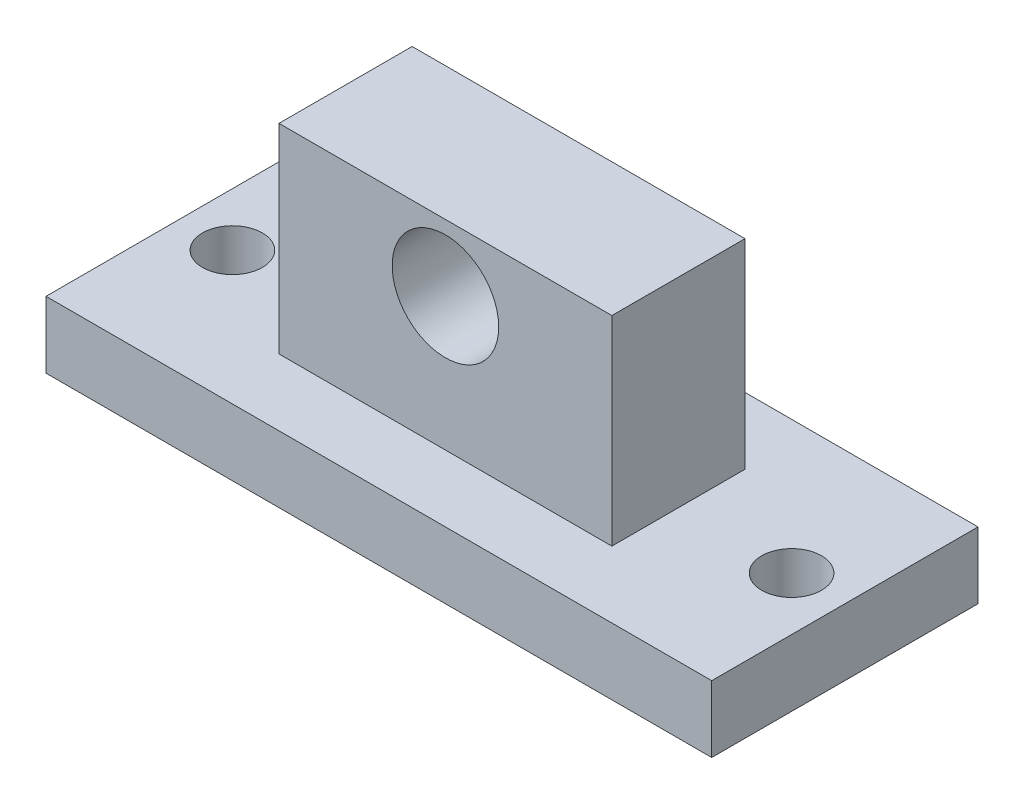
ISO-10303-21;
HEADER;
FILE_DESCRIPTION(('STEP AP214'),'2;1');
FILE_NAME('part.step','',(''),(''),'','','');
FILE_SCHEMA(('AUTOMOTIVE_DESIGN { 1 0 10303 214 1 1 1 1 }'));
ENDSEC;
DATA;
#1=APPLICATION_CONTEXT('core data for automotive mechanical design processes');
#2=APPLICATION_PROTOCOL_DEFINITION('international standard','automotive_design',2000,#1);
#3=PRODUCT_CONTEXT('',#1,'mechanical');
#4=PRODUCT('Part','Part','',(#3));
#5=PRODUCT_RELATED_PRODUCT_CATEGORY('part','',(#4));
#6=PRODUCT_DEFINITION_FORMATION('','',#4);
#7=PRODUCT_DEFINITION_CONTEXT('part definition',#1,'design');
#8=PRODUCT_DEFINITION('design','',#6,#7);
#9=PRODUCT_DEFINITION_SHAPE('','',#8);
#10=(LENGTH_UNIT() NAMED_UNIT(*) SI_UNIT(.MILLI.,.METRE.));
#11=(NAMED_UNIT(*) PLANE_ANGLE_UNIT() SI_UNIT($,.RADIAN.));
#12=(NAMED_UNIT(*) SI_UNIT($,.STERADIAN.) SOLID_ANGLE_UNIT());
#13=UNCERTAINTY_MEASURE_WITH_UNIT(LENGTH_MEASURE(1.E-05),#10,'distance_accuracy_value','');
#14=(GEOMETRIC_REPRESENTATION_CONTEXT(3) GLOBAL_UNCERTAINTY_ASSIGNED_CONTEXT((#13)) GLOBAL_UNIT_ASSIGNED_CONTEXT((#10,
#11,#12)) REPRESENTATION_CONTEXT('',''));
#15=CARTESIAN_POINT('',(0.,0.,0.));
#16=DIRECTION('',(0.,0.,1.));
#17=DIRECTION('',(1.,0.,0.));
#18=AXIS2_PLACEMENT_3D('',#15,#16,#17);
#19=CARTESIAN_POINT('',(0.,5.,0.));
#20=DIRECTION('',(0.,-1.,0.));
#21=DIRECTION('',(0.,0.,-1.));
#22=AXIS2_PLACEMENT_3D('',#19,#20,#21);
#23=PLANE('',#22);
#24=DIRECTION('',(0.,0.,-1.));
#25=VECTOR('',#24,1.);
#26=CARTESIAN_POINT('',(25.,5.,10.));
#27=LINE('',#26,#25);
#28=CARTESIAN_POINT('',(25.,5.,10.));
#29=VERTEX_POINT('',#28);
#30=CARTESIAN_POINT('',(25.,5.,-10.));
#31=VERTEX_POINT('',#30);
#32=EDGE_CURVE('E136',#29,#31,#27,.T.);
#33=ORIENTED_EDGE('',*,*,#32,.T.);
#34=DIRECTION('',(-1.,0.,0.));
#35=VECTOR('',#34,1.);
#36=CARTESIAN_POINT('',(-25.,5.,-10.));
#37=LINE('',#36,#35);
#38=CARTESIAN_POINT('',(-25.,5.,-10.));
#39=VERTEX_POINT('',#38);
#40=EDGE_CURVE('E139',#31,#39,#37,.T.);
#41=ORIENTED_EDGE('',*,*,#40,.T.);
#42=DIRECTION('',(0.,0.,1.));
#43=VECTOR('',#42,1.);
#44=CARTESIAN_POINT('',(-25.,5.,10.));
#45=LINE('',#44,#43);
#46=CARTESIAN_POINT('',(-25.,5.,10.));
#47=VERTEX_POINT('',#46);
#48=EDGE_CURVE('E142',#39,#47,#45,.T.);
#49=ORIENTED_EDGE('',*,*,#48,.T.);
#50=DIRECTION('',(1.,0.,0.));
#51=VECTOR('',#50,1.);
#52=CARTESIAN_POINT('',(-25.,5.,10.));
#53=LINE('',#52,#51);
#54=EDGE_CURVE('E144',#47,#29,#53,.T.);
#55=ORIENTED_EDGE('',*,*,#54,.T.);
#56=EDGE_LOOP('',(#33,#41,#49,#55));
#57=FACE_BOUND('',#56,.T.);
#58=CARTESIAN_POINT('',(21.,5.,0.));
#59=DIRECTION('',(0.,1.,0.));
#60=DIRECTION('',(0.,0.,1.));
#61=AXIS2_PLACEMENT_3D('',#58,#59,#60);
#62=CIRCLE('',#61,2.25);
#63=CARTESIAN_POINT('',(21.,5.,2.25));
#64=VERTEX_POINT('',#63);
#65=EDGE_CURVE('E118',#64,#64,#62,.T.);
#66=ORIENTED_EDGE('',*,*,#65,.F.);
#67=EDGE_LOOP('',(#66));
#68=FACE_BOUND('',#67,.T.);
#69=CARTESIAN_POINT('',(-21.,5.,0.));
#70=DIRECTION('',(0.,1.,0.));
#71=DIRECTION('',(0.,0.,1.));
#72=AXIS2_PLACEMENT_3D('',#69,#70,#71);
#73=CIRCLE('',#72,2.25);
#74=CARTESIAN_POINT('',(-21.,5.,2.25));
#75=VERTEX_POINT('',#74);
#76=EDGE_CURVE('E131',#75,#75,#73,.T.);
#77=ORIENTED_EDGE('',*,*,#76,.F.);
#78=EDGE_LOOP('',(#77));
#79=FACE_BOUND('',#78,.T.);
#80=DIRECTION('',(0.,0.,-1.));
#81=VECTOR('',#80,1.);
#82=CARTESIAN_POINT('',(12.5,5.,5.));
#83=LINE('',#82,#81);
#84=CARTESIAN_POINT('',(12.5,5.,5.));
#85=VERTEX_POINT('',#84);
#86=CARTESIAN_POINT('',(12.5,5.,-5.));
#87=VERTEX_POINT('',#86);
#88=EDGE_CURVE('E117',#85,#87,#83,.T.);
#89=ORIENTED_EDGE('',*,*,#88,.F.);
#90=DIRECTION('',(1.,0.,0.));
#91=VECTOR('',#90,1.);
#92=CARTESIAN_POINT('',(-12.5,5.,5.));
#93=LINE('',#92,#91);
#94=CARTESIAN_POINT('',(-12.5,5.,5.));
#95=VERTEX_POINT('',#94);
#96=EDGE_CURVE('E114',#95,#85,#93,.T.);
#97=ORIENTED_EDGE('',*,*,#96,.F.);
#98=DIRECTION('',(0.,0.,1.));
#99=VECTOR('',#98,1.);
#100=CARTESIAN_POINT('',(-12.5,5.,5.));
#101=LINE('',#100,#99);
#102=CARTESIAN_POINT('',(-12.5,5.,-5.));
#103=VERTEX_POINT('',#102);
#104=EDGE_CURVE('E52',#103,#95,#101,.T.);
#105=ORIENTED_EDGE('',*,*,#104,.F.);
#106=DIRECTION('',(-1.,0.,0.));
#107=VECTOR('',#106,1.);
#108=CARTESIAN_POINT('',(-12.5,5.,-5.));
#109=LINE('',#108,#107);
#110=EDGE_CURVE('E47',#87,#103,#109,.T.);
#111=ORIENTED_EDGE('',*,*,#110,.F.);
#112=EDGE_LOOP('',(#89,#97,#105,#111));
#113=FACE_BOUND('',#112,.T.);
#114=ADVANCED_FACE('F32',(#57,#68,#79,#113),#23,.F.);
#115=CARTESIAN_POINT('',(25.,5.,10.));
#116=DIRECTION('',(-1.,0.,0.));
#117=DIRECTION('',(0.,0.,1.));
#118=AXIS2_PLACEMENT_3D('',#115,#116,#117);
#119=PLANE('',#118);
#120=DIRECTION('',(0.,0.,-1.));
#121=VECTOR('',#120,1.);
#122=CARTESIAN_POINT('',(25.,0.,10.));
#123=LINE('',#122,#121);
#124=CARTESIAN_POINT('',(25.,0.,10.));
#125=VERTEX_POINT('',#124);
#126=CARTESIAN_POINT('',(25.,0.,-10.));
#127=VERTEX_POINT('',#126);
#128=EDGE_CURVE('E130',#125,#127,#123,.T.);
#129=ORIENTED_EDGE('',*,*,#128,.T.);
#130=DIRECTION('',(0.,-1.,0.));
#131=VECTOR('',#130,1.);
#132=CARTESIAN_POINT('',(25.,5.,-10.));
#133=LINE('',#132,#131);
#134=EDGE_CURVE('E11',#31,#127,#133,.T.);
#135=ORIENTED_EDGE('',*,*,#134,.F.);
#136=ORIENTED_EDGE('',*,*,#32,.F.);
#137=DIRECTION('',(0.,-1.,0.));
#138=VECTOR('',#137,1.);
#139=CARTESIAN_POINT('',(25.,5.,10.));
#140=LINE('',#139,#138);
#141=EDGE_CURVE('E146',#29,#125,#140,.T.);
#142=ORIENTED_EDGE('',*,*,#141,.T.);
#143=EDGE_LOOP('',(#129,#135,#136,#142));
#144=FACE_BOUND('',#143,.T.);
#145=ADVANCED_FACE('F34',(#144),#119,.F.);
#146=CARTESIAN_POINT('',(-25.,5.,-10.));
#147=DIRECTION('',(0.,0.,1.));
#148=DIRECTION('',(1.,0.,0.));
#149=AXIS2_PLACEMENT_3D('',#146,#147,#148);
#150=PLANE('',#149);
#151=DIRECTION('',(-1.,0.,0.));
#152=VECTOR('',#151,1.);
#153=CARTESIAN_POINT('',(-25.,0.,-10.));
#154=LINE('',#153,#152);
#155=CARTESIAN_POINT('',(-25.,0.,-10.));
#156=VERTEX_POINT('',#155);
#157=EDGE_CURVE('E149',#127,#156,#154,.T.);
#158=ORIENTED_EDGE('',*,*,#157,.T.);
#159=DIRECTION('',(0.,-1.,0.));
#160=VECTOR('',#159,1.);
#161=CARTESIAN_POINT('',(-25.,5.,-10.));
#162=LINE('',#161,#160);
#163=EDGE_CURVE('E40',#39,#156,#162,.T.);
#164=ORIENTED_EDGE('',*,*,#163,.F.);
#165=ORIENTED_EDGE('',*,*,#40,.F.);
#166=ORIENTED_EDGE('',*,*,#134,.T.);
#167=EDGE_LOOP('',(#158,#164,#165,#166));
#168=FACE_BOUND('',#167,.T.);
#169=ADVANCED_FACE('F179',(#168),#150,.F.);
#170=CARTESIAN_POINT('',(-25.,5.,10.));
#171=DIRECTION('',(1.,0.,0.));
#172=DIRECTION('',(0.,0.,-1.));
#173=AXIS2_PLACEMENT_3D('',#170,#171,#172);
#174=PLANE('',#173);
#175=DIRECTION('',(0.,0.,1.));
#176=VECTOR('',#175,1.);
#177=CARTESIAN_POINT('',(-25.,0.,10.));
#178=LINE('',#177,#176);
#179=CARTESIAN_POINT('',(-25.,0.,10.));
#180=VERTEX_POINT('',#179);
#181=EDGE_CURVE('E151',#156,#180,#178,.T.);
#182=ORIENTED_EDGE('',*,*,#181,.T.);
#183=DIRECTION('',(0.,-1.,0.));
#184=VECTOR('',#183,1.);
#185=CARTESIAN_POINT('',(-25.,5.,10.));
#186=LINE('',#185,#184);
#187=EDGE_CURVE('E156',#47,#180,#186,.T.);
#188=ORIENTED_EDGE('',*,*,#187,.F.);
#189=ORIENTED_EDGE('',*,*,#48,.F.);
#190=ORIENTED_EDGE('',*,*,#163,.T.);
#191=EDGE_LOOP('',(#182,#188,#189,#190));
#192=FACE_BOUND('',#191,.T.);
#193=ADVANCED_FACE('F163',(#192),#174,.F.);
#194=CARTESIAN_POINT('',(-25.,5.,10.));
#195=DIRECTION('',(0.,0.,-1.));
#196=DIRECTION('',(-1.,0.,0.));
#197=AXIS2_PLACEMENT_3D('',#194,#195,#196);
#198=PLANE('',#197);
#199=DIRECTION('',(1.,0.,0.));
#200=VECTOR('',#199,1.);
#201=CARTESIAN_POINT('',(-25.,0.,10.));
#202=LINE('',#201,#200);
#203=EDGE_CURVE('E140',#180,#125,#202,.T.);
#204=ORIENTED_EDGE('',*,*,#203,.T.);
#205=ORIENTED_EDGE('',*,*,#141,.F.);
#206=ORIENTED_EDGE('',*,*,#54,.F.);
#207=ORIENTED_EDGE('',*,*,#187,.T.);
#208=EDGE_LOOP('',(#204,#205,#206,#207));
#209=FACE_BOUND('',#208,.T.);
#210=ADVANCED_FACE('F172',(#209),#198,.F.);
#211=CARTESIAN_POINT('',(0.,0.,0.));
#212=DIRECTION('',(0.,-1.,0.));
#213=DIRECTION('',(0.,0.,-1.));
#214=AXIS2_PLACEMENT_3D('',#211,#212,#213);
#215=PLANE('',#214);
#216=CARTESIAN_POINT('',(-21.,0.,0.));
#217=DIRECTION('',(0.,1.,0.));
#218=DIRECTION('',(0.,0.,1.));
#219=AXIS2_PLACEMENT_3D('',#216,#217,#218);
#220=CIRCLE('',#219,2.25);
#221=CARTESIAN_POINT('',(-21.,0.,2.25));
#222=VERTEX_POINT('',#221);
#223=EDGE_CURVE('E127',#222,#222,#220,.T.);
#224=ORIENTED_EDGE('',*,*,#223,.T.);
#225=EDGE_LOOP('',(#224));
#226=FACE_BOUND('',#225,.T.);
#227=CARTESIAN_POINT('',(21.,0.,0.));
#228=DIRECTION('',(0.,1.,0.));
#229=DIRECTION('',(0.,0.,1.));
#230=AXIS2_PLACEMENT_3D('',#227,#228,#229);
#231=CIRCLE('',#230,2.25);
#232=CARTESIAN_POINT('',(21.,0.,2.25));
#233=VERTEX_POINT('',#232);
#234=EDGE_CURVE('E121',#233,#233,#231,.T.);
#235=ORIENTED_EDGE('',*,*,#234,.T.);
#236=EDGE_LOOP('',(#235));
#237=FACE_BOUND('',#236,.T.);
#238=ORIENTED_EDGE('',*,*,#128,.F.);
#239=ORIENTED_EDGE('',*,*,#203,.F.);
#240=ORIENTED_EDGE('',*,*,#181,.F.);
#241=ORIENTED_EDGE('',*,*,#157,.F.);
#242=EDGE_LOOP('',(#238,#239,#240,#241));
#243=FACE_BOUND('',#242,.T.);
#244=ADVANCED_FACE('F169',(#226,#237,#243),#215,.T.);
#245=CARTESIAN_POINT('',(21.,0.,0.));
#246=DIRECTION('',(0.,1.,0.));
#247=DIRECTION('',(0.,0.,1.));
#248=AXIS2_PLACEMENT_3D('',#245,#246,#247);
#249=CYLINDRICAL_SURFACE('',#248,2.25);
#250=ORIENTED_EDGE('',*,*,#234,.F.);
#251=EDGE_LOOP('',(#250));
#252=FACE_BOUND('',#251,.T.);
#253=ORIENTED_EDGE('',*,*,#65,.T.);
#254=EDGE_LOOP('',(#253));
#255=FACE_BOUND('',#254,.T.);
#256=ADVANCED_FACE('F192',(#252,#255),#249,.F.);
#257=CARTESIAN_POINT('',(-21.,0.,0.));
#258=DIRECTION('',(0.,1.,0.));
#259=DIRECTION('',(0.,0.,1.));
#260=AXIS2_PLACEMENT_3D('',#257,#258,#259);
#261=CYLINDRICAL_SURFACE('',#260,2.25);
#262=ORIENTED_EDGE('',*,*,#223,.F.);
#263=EDGE_LOOP('',(#262));
#264=FACE_BOUND('',#263,.T.);
#265=ORIENTED_EDGE('',*,*,#76,.T.);
#266=EDGE_LOOP('',(#265));
#267=FACE_BOUND('',#266,.T.);
#268=ADVANCED_FACE('F212',(#264,#267),#261,.F.);
#269=CARTESIAN_POINT('',(12.5,20.,5.));
#270=DIRECTION('',(-1.,0.,0.));
#271=DIRECTION('',(0.,0.,1.));
#272=AXIS2_PLACEMENT_3D('',#269,#270,#271);
#273=PLANE('',#272);
#274=ORIENTED_EDGE('',*,*,#88,.T.);
#275=DIRECTION('',(0.,-1.,0.));
#276=VECTOR('',#275,1.);
#277=CARTESIAN_POINT('',(12.5,20.,-5.));
#278=LINE('',#277,#276);
#279=CARTESIAN_POINT('',(12.5,20.,-5.));
#280=VERTEX_POINT('',#279);
#281=EDGE_CURVE('E98',#280,#87,#278,.T.);
#282=ORIENTED_EDGE('',*,*,#281,.F.);
#283=DIRECTION('',(0.,0.,-1.));
#284=VECTOR('',#283,1.);
#285=CARTESIAN_POINT('',(12.5,20.,5.));
#286=LINE('',#285,#284);
#287=CARTESIAN_POINT('',(12.5,20.,5.));
#288=VERTEX_POINT('',#287);
#289=EDGE_CURVE('E105',#288,#280,#286,.T.);
#290=ORIENTED_EDGE('',*,*,#289,.F.);
#291=DIRECTION('',(0.,-1.,0.));
#292=VECTOR('',#291,1.);
#293=CARTESIAN_POINT('',(12.5,20.,5.));
#294=LINE('',#293,#292);
#295=EDGE_CURVE('E314',#288,#85,#294,.T.);
#296=ORIENTED_EDGE('',*,*,#295,.T.);
#297=EDGE_LOOP('',(#274,#282,#290,#296));
#298=FACE_BOUND('',#297,.T.);
#299=ADVANCED_FACE('F116',(#298),#273,.F.);
#300=CARTESIAN_POINT('',(-12.5,20.,-5.));
#301=DIRECTION('',(0.,0.,1.));
#302=DIRECTION('',(1.,0.,0.));
#303=AXIS2_PLACEMENT_3D('',#300,#301,#302);
#304=PLANE('',#303);
#305=CARTESIAN_POINT('',(0.,15.,-5.));
#306=DIRECTION('',(0.,0.,1.));
#307=DIRECTION('',(1.,0.,0.));
#308=AXIS2_PLACEMENT_3D('',#305,#306,#307);
#309=CIRCLE('',#308,4.);
#310=CARTESIAN_POINT('',(4.,15.,-5.));
#311=VERTEX_POINT('',#310);
#312=EDGE_CURVE('E308',#311,#311,#309,.T.);
#313=ORIENTED_EDGE('',*,*,#312,.T.);
#314=EDGE_LOOP('',(#313));
#315=FACE_BOUND('',#314,.T.);
#316=ORIENTED_EDGE('',*,*,#110,.T.);
#317=DIRECTION('',(0.,-1.,0.));
#318=VECTOR('',#317,1.);
#319=CARTESIAN_POINT('',(-12.5,20.,-5.));
#320=LINE('',#319,#318);
#321=CARTESIAN_POINT('',(-12.5,20.,-5.));
#322=VERTEX_POINT('',#321);
#323=EDGE_CURVE('E101',#322,#103,#320,.T.);
#324=ORIENTED_EDGE('',*,*,#323,.F.);
#325=DIRECTION('',(-1.,0.,0.));
#326=VECTOR('',#325,1.);
#327=CARTESIAN_POINT('',(-12.5,20.,-5.));
#328=LINE('',#327,#326);
#329=EDGE_CURVE('E94',#280,#322,#328,.T.);
#330=ORIENTED_EDGE('',*,*,#329,.F.);
#331=ORIENTED_EDGE('',*,*,#281,.T.);
#332=EDGE_LOOP('',(#316,#324,#330,#331));
#333=FACE_BOUND('',#332,.T.);
#334=ADVANCED_FACE('F96',(#315,#333),#304,.F.);
#335=CARTESIAN_POINT('',(-12.5,20.,5.));
#336=DIRECTION('',(1.,0.,0.));
#337=DIRECTION('',(0.,0.,-1.));
#338=AXIS2_PLACEMENT_3D('',#335,#336,#337);
#339=PLANE('',#338);
#340=ORIENTED_EDGE('',*,*,#104,.T.);
#341=DIRECTION('',(0.,-1.,0.));
#342=VECTOR('',#341,1.);
#343=CARTESIAN_POINT('',(-12.5,20.,5.));
#344=LINE('',#343,#342);
#345=CARTESIAN_POINT('',(-12.5,20.,5.));
#346=VERTEX_POINT('',#345);
#347=EDGE_CURVE('E123',#346,#95,#344,.T.);
#348=ORIENTED_EDGE('',*,*,#347,.F.);
#349=DIRECTION('',(0.,0.,1.));
#350=VECTOR('',#349,1.);
#351=CARTESIAN_POINT('',(-12.5,20.,5.));
#352=LINE('',#351,#350);
#353=EDGE_CURVE('E104',#322,#346,#352,.T.);
#354=ORIENTED_EDGE('',*,*,#353,.F.);
#355=ORIENTED_EDGE('',*,*,#323,.T.);
#356=EDGE_LOOP('',(#340,#348,#354,#355));
#357=FACE_BOUND('',#356,.T.);
#358=ADVANCED_FACE('F232',(#357),#339,.F.);
#359=CARTESIAN_POINT('',(-12.5,20.,5.));
#360=DIRECTION('',(0.,0.,-1.));
#361=DIRECTION('',(-1.,0.,0.));
#362=AXIS2_PLACEMENT_3D('',#359,#360,#361);
#363=PLANE('',#362);
#364=CARTESIAN_POINT('',(0.,15.,5.));
#365=DIRECTION('',(0.,0.,1.));
#366=DIRECTION('',(1.,0.,0.));
#367=AXIS2_PLACEMENT_3D('',#364,#365,#366);
#368=CIRCLE('',#367,4.);
#369=CARTESIAN_POINT('',(4.,15.,5.));
#370=VERTEX_POINT('',#369);
#371=EDGE_CURVE('E305',#370,#370,#368,.T.);
#372=ORIENTED_EDGE('',*,*,#371,.F.);
#373=EDGE_LOOP('',(#372));
#374=FACE_BOUND('',#373,.T.);
#375=ORIENTED_EDGE('',*,*,#96,.T.);
#376=ORIENTED_EDGE('',*,*,#295,.F.);
#377=DIRECTION('',(1.,0.,0.));
#378=VECTOR('',#377,1.);
#379=CARTESIAN_POINT('',(-12.5,20.,5.));
#380=LINE('',#379,#378);
#381=EDGE_CURVE('E110',#346,#288,#380,.T.);
#382=ORIENTED_EDGE('',*,*,#381,.F.);
#383=ORIENTED_EDGE('',*,*,#347,.T.);
#384=EDGE_LOOP('',(#375,#376,#382,#383));
#385=FACE_BOUND('',#384,.T.);
#386=ADVANCED_FACE('F241',(#374,#385),#363,.F.);
#387=CARTESIAN_POINT('',(0.,20.,0.));
#388=DIRECTION('',(0.,-1.,0.));
#389=DIRECTION('',(0.,0.,-1.));
#390=AXIS2_PLACEMENT_3D('',#387,#388,#389);
#391=PLANE('',#390);
#392=ORIENTED_EDGE('',*,*,#289,.T.);
#393=ORIENTED_EDGE('',*,*,#329,.T.);
#394=ORIENTED_EDGE('',*,*,#353,.T.);
#395=ORIENTED_EDGE('',*,*,#381,.T.);
#396=EDGE_LOOP('',(#392,#393,#394,#395));
#397=FACE_BOUND('',#396,.T.);
#398=ADVANCED_FACE('F108',(#397),#391,.F.);
#399=CARTESIAN_POINT('',(0.,15.,-10.));
#400=DIRECTION('',(0.,0.,1.));
#401=DIRECTION('',(1.,0.,0.));
#402=AXIS2_PLACEMENT_3D('',#399,#400,#401);
#403=CYLINDRICAL_SURFACE('',#402,4.);
#404=ORIENTED_EDGE('',*,*,#371,.T.);
#405=EDGE_LOOP('',(#404));
#406=FACE_BOUND('',#405,.T.);
#407=ORIENTED_EDGE('',*,*,#312,.F.);
#408=EDGE_LOOP('',(#407));
#409=FACE_BOUND('',#408,.T.);
#410=ADVANCED_FACE('F255',(#406,#409),#403,.F.);
#411=CLOSED_SHELL('',(#114,#145,#169,#193,#210,#244,#256,#268,#299,#334,#358,#386,#398,#410));
#412=MANIFOLD_SOLID_BREP('B2',#411);
#413=ADVANCED_BREP_SHAPE_REPRESENTATION('',(#18,#412),#14);
#414=SHAPE_DEFINITION_REPRESENTATION(#9,#413);
ENDSEC;
END-ISO-10303-21;
